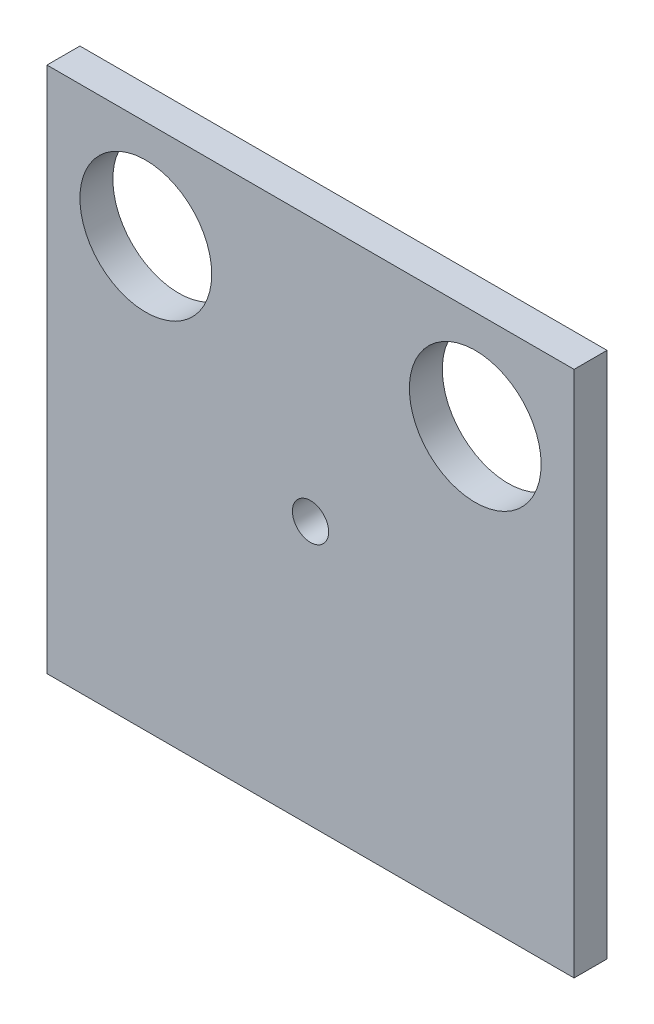
ISO-10303-21;
HEADER;
FILE_DESCRIPTION(('STEP AP214'),'2;1');
FILE_NAME('part.step','',(''),(''),'','','');
FILE_SCHEMA(('AUTOMOTIVE_DESIGN { 1 0 10303 214 1 1 1 1 }'));
ENDSEC;
DATA;
#1=APPLICATION_CONTEXT('core data for automotive mechanical design processes');
#2=APPLICATION_PROTOCOL_DEFINITION('international standard','automotive_design',2000,#1);
#3=PRODUCT_CONTEXT('',#1,'mechanical');
#4=PRODUCT('Part','Part','',(#3));
#5=PRODUCT_RELATED_PRODUCT_CATEGORY('part','',(#4));
#6=PRODUCT_DEFINITION_FORMATION('','',#4);
#7=PRODUCT_DEFINITION_CONTEXT('part definition',#1,'design');
#8=PRODUCT_DEFINITION('design','',#6,#7);
#9=PRODUCT_DEFINITION_SHAPE('','',#8);
#10=(LENGTH_UNIT() NAMED_UNIT(*) SI_UNIT(.MILLI.,.METRE.));
#11=(NAMED_UNIT(*) PLANE_ANGLE_UNIT() SI_UNIT($,.RADIAN.));
#12=(NAMED_UNIT(*) SI_UNIT($,.STERADIAN.) SOLID_ANGLE_UNIT());
#13=UNCERTAINTY_MEASURE_WITH_UNIT(LENGTH_MEASURE(1.E-05),#10,'distance_accuracy_value','');
#14=(GEOMETRIC_REPRESENTATION_CONTEXT(3) GLOBAL_UNCERTAINTY_ASSIGNED_CONTEXT((#13)) GLOBAL_UNIT_ASSIGNED_CONTEXT((#10,
#11,#12)) REPRESENTATION_CONTEXT('',''));
#15=CARTESIAN_POINT('',(0.,0.,0.));
#16=DIRECTION('',(0.,0.,1.));
#17=DIRECTION('',(1.,0.,0.));
#18=AXIS2_PLACEMENT_3D('',#15,#16,#17);
#19=CARTESIAN_POINT('',(0.,0.,6.35));
#20=DIRECTION('',(0.,0.,-1.));
#21=DIRECTION('',(-1.,0.,0.));
#22=AXIS2_PLACEMENT_3D('',#19,#20,#21);
#23=PLANE('',#22);
#24=DIRECTION('',(0.,-1.,0.));
#25=VECTOR('',#24,1.);
#26=CARTESIAN_POINT('',(0.,0.,6.35));
#27=LINE('',#26,#25);
#28=CARTESIAN_POINT('',(0.,101.6,6.35));
#29=VERTEX_POINT('',#28);
#30=CARTESIAN_POINT('',(0.,0.,6.35));
#31=VERTEX_POINT('',#30);
#32=EDGE_CURVE('E88',#29,#31,#27,.T.);
#33=ORIENTED_EDGE('',*,*,#32,.T.);
#34=DIRECTION('',(1.,0.,0.));
#35=VECTOR('',#34,1.);
#36=CARTESIAN_POINT('',(0.,0.,6.35));
#37=LINE('',#36,#35);
#38=CARTESIAN_POINT('',(101.6,0.,6.35));
#39=VERTEX_POINT('',#38);
#40=EDGE_CURVE('E83',#31,#39,#37,.T.);
#41=ORIENTED_EDGE('',*,*,#40,.T.);
#42=DIRECTION('',(0.,1.,0.));
#43=VECTOR('',#42,1.);
#44=CARTESIAN_POINT('',(101.6,0.,6.35));
#45=LINE('',#44,#43);
#46=CARTESIAN_POINT('',(101.6,101.6,6.35));
#47=VERTEX_POINT('',#46);
#48=EDGE_CURVE('E86',#39,#47,#45,.T.);
#49=ORIENTED_EDGE('',*,*,#48,.T.);
#50=DIRECTION('',(-1.,0.,0.));
#51=VECTOR('',#50,1.);
#52=CARTESIAN_POINT('',(0.,101.6,6.35));
#53=LINE('',#52,#51);
#54=EDGE_CURVE('E53',#47,#29,#53,.T.);
#55=ORIENTED_EDGE('',*,*,#54,.T.);
#56=EDGE_LOOP('',(#33,#41,#49,#55));
#57=FACE_BOUND('',#56,.T.);
#58=CARTESIAN_POINT('',(19.05,82.55,6.35));
#59=DIRECTION('',(0.,0.,1.));
#60=DIRECTION('',(1.,0.,0.));
#61=AXIS2_PLACEMENT_3D('',#58,#59,#60);
#62=CIRCLE('',#61,12.7);
#63=CARTESIAN_POINT('',(31.75,82.55,6.35));
#64=VERTEX_POINT('',#63);
#65=EDGE_CURVE('E103',#64,#64,#62,.T.);
#66=ORIENTED_EDGE('',*,*,#65,.F.);
#67=EDGE_LOOP('',(#66));
#68=FACE_BOUND('',#67,.T.);
#69=CARTESIAN_POINT('',(82.55,82.55,6.35));
#70=DIRECTION('',(0.,0.,1.));
#71=DIRECTION('',(1.,0.,0.));
#72=AXIS2_PLACEMENT_3D('',#69,#70,#71);
#73=CIRCLE('',#72,12.7);
#74=CARTESIAN_POINT('',(95.25,82.55,6.35));
#75=VERTEX_POINT('',#74);
#76=EDGE_CURVE('E118',#75,#75,#73,.T.);
#77=ORIENTED_EDGE('',*,*,#76,.F.);
#78=EDGE_LOOP('',(#77));
#79=FACE_BOUND('',#78,.T.);
#80=CARTESIAN_POINT('',(50.8,50.8,6.35));
#81=DIRECTION('',(0.,0.,1.));
#82=DIRECTION('',(1.,0.,0.));
#83=AXIS2_PLACEMENT_3D('',#80,#81,#82);
#84=CIRCLE('',#83,3.49250000000001);
#85=CARTESIAN_POINT('',(54.2925,50.8,6.35));
#86=VERTEX_POINT('',#85);
#87=EDGE_CURVE('E124',#86,#86,#84,.T.);
#88=ORIENTED_EDGE('',*,*,#87,.F.);
#89=EDGE_LOOP('',(#88));
#90=FACE_BOUND('',#89,.T.);
#91=ADVANCED_FACE('F36',(#57,#68,#79,#90),#23,.F.);
#92=CARTESIAN_POINT('',(0.,0.,0.));
#93=DIRECTION('',(0.,0.,-1.));
#94=DIRECTION('',(-1.,0.,0.));
#95=AXIS2_PLACEMENT_3D('',#92,#93,#94);
#96=PLANE('',#95);
#97=CARTESIAN_POINT('',(82.55,82.55,0.));
#98=DIRECTION('',(0.,0.,1.));
#99=DIRECTION('',(1.,0.,0.));
#100=AXIS2_PLACEMENT_3D('',#97,#98,#99);
#101=CIRCLE('',#100,12.7);
#102=CARTESIAN_POINT('',(95.25,82.55,0.));
#103=VERTEX_POINT('',#102);
#104=EDGE_CURVE('E121',#103,#103,#101,.T.);
#105=ORIENTED_EDGE('',*,*,#104,.T.);
#106=EDGE_LOOP('',(#105));
#107=FACE_BOUND('',#106,.T.);
#108=DIRECTION('',(0.,-1.,0.));
#109=VECTOR('',#108,1.);
#110=CARTESIAN_POINT('',(0.,0.,0.));
#111=LINE('',#110,#109);
#112=CARTESIAN_POINT('',(0.,101.6,0.));
#113=VERTEX_POINT('',#112);
#114=CARTESIAN_POINT('',(0.,0.,0.));
#115=VERTEX_POINT('',#114);
#116=EDGE_CURVE('E100',#113,#115,#111,.T.);
#117=ORIENTED_EDGE('',*,*,#116,.F.);
#118=DIRECTION('',(-1.,0.,0.));
#119=VECTOR('',#118,1.);
#120=CARTESIAN_POINT('',(0.,101.6,0.));
#121=LINE('',#120,#119);
#122=CARTESIAN_POINT('',(101.6,101.6,0.));
#123=VERTEX_POINT('',#122);
#124=EDGE_CURVE('E76',#123,#113,#121,.T.);
#125=ORIENTED_EDGE('',*,*,#124,.F.);
#126=DIRECTION('',(0.,1.,0.));
#127=VECTOR('',#126,1.);
#128=CARTESIAN_POINT('',(101.6,0.,0.));
#129=LINE('',#128,#127);
#130=CARTESIAN_POINT('',(101.6,0.,0.));
#131=VERTEX_POINT('',#130);
#132=EDGE_CURVE('E70',#131,#123,#129,.T.);
#133=ORIENTED_EDGE('',*,*,#132,.F.);
#134=DIRECTION('',(1.,0.,0.));
#135=VECTOR('',#134,1.);
#136=CARTESIAN_POINT('',(0.,0.,0.));
#137=LINE('',#136,#135);
#138=EDGE_CURVE('E92',#115,#131,#137,.T.);
#139=ORIENTED_EDGE('',*,*,#138,.F.);
#140=EDGE_LOOP('',(#117,#125,#133,#139));
#141=FACE_BOUND('',#140,.T.);
#142=CARTESIAN_POINT('',(19.05,82.55,0.));
#143=DIRECTION('',(0.,0.,1.));
#144=DIRECTION('',(1.,0.,0.));
#145=AXIS2_PLACEMENT_3D('',#142,#143,#144);
#146=CIRCLE('',#145,12.7);
#147=CARTESIAN_POINT('',(31.75,82.55,0.));
#148=VERTEX_POINT('',#147);
#149=EDGE_CURVE('E115',#148,#148,#146,.T.);
#150=ORIENTED_EDGE('',*,*,#149,.T.);
#151=EDGE_LOOP('',(#150));
#152=FACE_BOUND('',#151,.T.);
#153=CARTESIAN_POINT('',(50.8,50.8,0.));
#154=DIRECTION('',(0.,0.,1.));
#155=DIRECTION('',(1.,0.,0.));
#156=AXIS2_PLACEMENT_3D('',#153,#154,#155);
#157=CIRCLE('',#156,3.49250000000001);
#158=CARTESIAN_POINT('',(54.2925,50.8,0.));
#159=VERTEX_POINT('',#158);
#160=EDGE_CURVE('E127',#159,#159,#157,.T.);
#161=ORIENTED_EDGE('',*,*,#160,.T.);
#162=EDGE_LOOP('',(#161));
#163=FACE_BOUND('',#162,.T.);
#164=ADVANCED_FACE('F111',(#107,#141,#152,#163),#96,.T.);
#165=CARTESIAN_POINT('',(0.,0.,6.35));
#166=DIRECTION('',(1.,0.,0.));
#167=DIRECTION('',(0.,0.,-1.));
#168=AXIS2_PLACEMENT_3D('',#165,#166,#167);
#169=PLANE('',#168);
#170=ORIENTED_EDGE('',*,*,#116,.T.);
#171=DIRECTION('',(0.,0.,-1.));
#172=VECTOR('',#171,1.);
#173=CARTESIAN_POINT('',(0.,0.,6.35));
#174=LINE('',#173,#172);
#175=EDGE_CURVE('E11',#31,#115,#174,.T.);
#176=ORIENTED_EDGE('',*,*,#175,.F.);
#177=ORIENTED_EDGE('',*,*,#32,.F.);
#178=DIRECTION('',(0.,0.,-1.));
#179=VECTOR('',#178,1.);
#180=CARTESIAN_POINT('',(0.,101.6,6.35));
#181=LINE('',#180,#179);
#182=EDGE_CURVE('E96',#29,#113,#181,.T.);
#183=ORIENTED_EDGE('',*,*,#182,.T.);
#184=EDGE_LOOP('',(#170,#176,#177,#183));
#185=FACE_BOUND('',#184,.T.);
#186=ADVANCED_FACE('F38',(#185),#169,.F.);
#187=CARTESIAN_POINT('',(0.,0.,6.35));
#188=DIRECTION('',(0.,1.,0.));
#189=DIRECTION('',(0.,0.,1.));
#190=AXIS2_PLACEMENT_3D('',#187,#188,#189);
#191=PLANE('',#190);
#192=ORIENTED_EDGE('',*,*,#138,.T.);
#193=DIRECTION('',(0.,0.,-1.));
#194=VECTOR('',#193,1.);
#195=CARTESIAN_POINT('',(101.6,0.,6.35));
#196=LINE('',#195,#194);
#197=EDGE_CURVE('E45',#39,#131,#196,.T.);
#198=ORIENTED_EDGE('',*,*,#197,.F.);
#199=ORIENTED_EDGE('',*,*,#40,.F.);
#200=ORIENTED_EDGE('',*,*,#175,.T.);
#201=EDGE_LOOP('',(#192,#198,#199,#200));
#202=FACE_BOUND('',#201,.T.);
#203=ADVANCED_FACE('F91',(#202),#191,.F.);
#204=CARTESIAN_POINT('',(101.6,0.,6.35));
#205=DIRECTION('',(-1.,0.,0.));
#206=DIRECTION('',(0.,0.,1.));
#207=AXIS2_PLACEMENT_3D('',#204,#205,#206);
#208=PLANE('',#207);
#209=ORIENTED_EDGE('',*,*,#132,.T.);
#210=DIRECTION('',(0.,0.,-1.));
#211=VECTOR('',#210,1.);
#212=CARTESIAN_POINT('',(101.6,101.6,6.35));
#213=LINE('',#212,#211);
#214=EDGE_CURVE('E93',#47,#123,#213,.T.);
#215=ORIENTED_EDGE('',*,*,#214,.F.);
#216=ORIENTED_EDGE('',*,*,#48,.F.);
#217=ORIENTED_EDGE('',*,*,#197,.T.);
#218=EDGE_LOOP('',(#209,#215,#216,#217));
#219=FACE_BOUND('',#218,.T.);
#220=ADVANCED_FACE('F94',(#219),#208,.F.);
#221=CARTESIAN_POINT('',(0.,101.6,6.35));
#222=DIRECTION('',(0.,-1.,0.));
#223=DIRECTION('',(0.,0.,-1.));
#224=AXIS2_PLACEMENT_3D('',#221,#222,#223);
#225=PLANE('',#224);
#226=ORIENTED_EDGE('',*,*,#124,.T.);
#227=ORIENTED_EDGE('',*,*,#182,.F.);
#228=ORIENTED_EDGE('',*,*,#54,.F.);
#229=ORIENTED_EDGE('',*,*,#214,.T.);
#230=EDGE_LOOP('',(#226,#227,#228,#229));
#231=FACE_BOUND('',#230,.T.);
#232=ADVANCED_FACE('F108',(#231),#225,.F.);
#233=CARTESIAN_POINT('',(19.05,82.55,6.35));
#234=DIRECTION('',(0.,0.,-1.));
#235=DIRECTION('',(-1.,0.,0.));
#236=AXIS2_PLACEMENT_3D('',#233,#234,#235);
#237=CYLINDRICAL_SURFACE('',#236,12.7);
#238=ORIENTED_EDGE('',*,*,#65,.T.);
#239=EDGE_LOOP('',(#238));
#240=FACE_BOUND('',#239,.T.);
#241=ORIENTED_EDGE('',*,*,#149,.F.);
#242=EDGE_LOOP('',(#241));
#243=FACE_BOUND('',#242,.T.);
#244=ADVANCED_FACE('F144',(#240,#243),#237,.F.);
#245=CARTESIAN_POINT('',(82.55,82.55,6.35));
#246=DIRECTION('',(0.,0.,-1.));
#247=DIRECTION('',(-1.,0.,0.));
#248=AXIS2_PLACEMENT_3D('',#245,#246,#247);
#249=CYLINDRICAL_SURFACE('',#248,12.7);
#250=ORIENTED_EDGE('',*,*,#76,.T.);
#251=EDGE_LOOP('',(#250));
#252=FACE_BOUND('',#251,.T.);
#253=ORIENTED_EDGE('',*,*,#104,.F.);
#254=EDGE_LOOP('',(#253));
#255=FACE_BOUND('',#254,.T.);
#256=ADVANCED_FACE('F190',(#252,#255),#249,.F.);
#257=CARTESIAN_POINT('',(50.8,50.8,6.35));
#258=DIRECTION('',(0.,0.,-1.));
#259=DIRECTION('',(-1.,0.,0.));
#260=AXIS2_PLACEMENT_3D('',#257,#258,#259);
#261=CYLINDRICAL_SURFACE('',#260,3.49250000000001);
#262=ORIENTED_EDGE('',*,*,#87,.T.);
#263=EDGE_LOOP('',(#262));
#264=FACE_BOUND('',#263,.T.);
#265=ORIENTED_EDGE('',*,*,#160,.F.);
#266=EDGE_LOOP('',(#265));
#267=FACE_BOUND('',#266,.T.);
#268=ADVANCED_FACE('F133',(#264,#267),#261,.F.);
#269=CLOSED_SHELL('',(#91,#164,#186,#203,#220,#232,#244,#256,#268));
#270=MANIFOLD_SOLID_BREP('B2',#269);
#271=ADVANCED_BREP_SHAPE_REPRESENTATION('',(#18,#270),#14);
#272=SHAPE_DEFINITION_REPRESENTATION(#9,#271);
ENDSEC;
END-ISO-10303-21;
